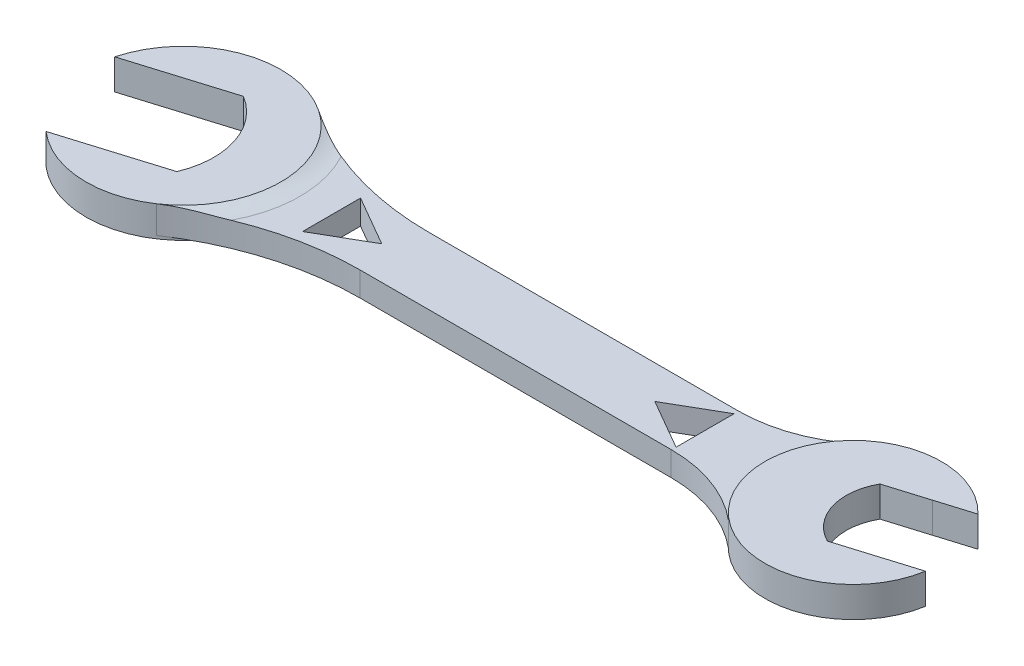
ISO-10303-21;
HEADER;
FILE_DESCRIPTION(('STEP AP214'),'2;1');
FILE_NAME('part.step','',(''),(''),'','','');
FILE_SCHEMA(('AUTOMOTIVE_DESIGN { 1 0 10303 214 1 1 1 1 }'));
ENDSEC;
DATA;
#1=APPLICATION_CONTEXT('core data for automotive mechanical design processes');
#2=APPLICATION_PROTOCOL_DEFINITION('international standard','automotive_design',2000,#1);
#3=PRODUCT_CONTEXT('',#1,'mechanical');
#4=PRODUCT('Part','Part','',(#3));
#5=PRODUCT_RELATED_PRODUCT_CATEGORY('part','',(#4));
#6=PRODUCT_DEFINITION_FORMATION('','',#4);
#7=PRODUCT_DEFINITION_CONTEXT('part definition',#1,'design');
#8=PRODUCT_DEFINITION('design','',#6,#7);
#9=PRODUCT_DEFINITION_SHAPE('','',#8);
#10=(LENGTH_UNIT() NAMED_UNIT(*) SI_UNIT(.MILLI.,.METRE.));
#11=(NAMED_UNIT(*) PLANE_ANGLE_UNIT() SI_UNIT($,.RADIAN.));
#12=(NAMED_UNIT(*) SI_UNIT($,.STERADIAN.) SOLID_ANGLE_UNIT());
#13=UNCERTAINTY_MEASURE_WITH_UNIT(LENGTH_MEASURE(1.E-05),#10,'distance_accuracy_value','');
#14=(GEOMETRIC_REPRESENTATION_CONTEXT(3) GLOBAL_UNCERTAINTY_ASSIGNED_CONTEXT((#13)) GLOBAL_UNIT_ASSIGNED_CONTEXT((#10,
#11,#12)) REPRESENTATION_CONTEXT('',''));
#15=CARTESIAN_POINT('',(0.,0.,0.));
#16=DIRECTION('',(0.,0.,1.));
#17=DIRECTION('',(1.,0.,0.));
#18=AXIS2_PLACEMENT_3D('',#15,#16,#17);
#19=CARTESIAN_POINT('',(30.602024101942,2.,28.5700682179415));
#20=DIRECTION('',(0.,-1.,0.));
#21=DIRECTION('',(0.,0.,-1.));
#22=AXIS2_PLACEMENT_3D('',#19,#20,#21);
#23=CYLINDRICAL_SURFACE('',#22,23.0700682179416);
#24=CARTESIAN_POINT('',(30.602024101942,-2.,28.5700682179415));
#25=DIRECTION('',(0.,1.,0.));
#26=DIRECTION('',(0.,0.,1.));
#27=AXIS2_PLACEMENT_3D('',#24,#25,#26);
#28=CIRCLE('',#27,23.0700682179416);
#29=CARTESIAN_POINT('',(45.5837101899976,-2.,11.0264902037668));
#30=VERTEX_POINT('',#29);
#31=CARTESIAN_POINT('',(30.602024101942,-2.,5.49999999999999));
#32=VERTEX_POINT('',#31);
#33=EDGE_CURVE('E342',#30,#32,#28,.T.);
#34=ORIENTED_EDGE('',*,*,#33,.F.);
#35=DIRECTION('',(0.,-1.,0.));
#36=VECTOR('',#35,1.);
#37=CARTESIAN_POINT('',(45.5837101899976,2.,11.0264902037668));
#38=LINE('',#37,#36);
#39=CARTESIAN_POINT('',(45.5837101899976,2.,11.0264902037668));
#40=VERTEX_POINT('',#39);
#41=EDGE_CURVE('E390',#40,#30,#38,.T.);
#42=ORIENTED_EDGE('',*,*,#41,.F.);
#43=CARTESIAN_POINT('',(30.602024101942,2.,28.5700682179415));
#44=DIRECTION('',(0.,1.,0.));
#45=DIRECTION('',(0.,0.,1.));
#46=AXIS2_PLACEMENT_3D('',#43,#44,#45);
#47=CIRCLE('',#46,23.0700682179416);
#48=CARTESIAN_POINT('',(30.602024101942,2.,5.49999999999999));
#49=VERTEX_POINT('',#48);
#50=EDGE_CURVE('E343',#40,#49,#47,.T.);
#51=ORIENTED_EDGE('',*,*,#50,.T.);
#52=DIRECTION('',(0.,-1.,0.));
#53=VECTOR('',#52,1.);
#54=CARTESIAN_POINT('',(30.602024101942,2.,5.49999999999999));
#55=LINE('',#54,#53);
#56=EDGE_CURVE('E359',#49,#32,#55,.T.);
#57=ORIENTED_EDGE('',*,*,#56,.T.);
#58=EDGE_LOOP('',(#34,#42,#51,#57));
#59=FACE_BOUND('',#58,.T.);
#60=ADVANCED_FACE('F37',(#59),#23,.F.);
#61=CARTESIAN_POINT('',(30.5761125724405,2.,-28.6403487263792));
#62=DIRECTION('',(0.,-1.,0.));
#63=DIRECTION('',(0.,0.,-1.));
#64=AXIS2_PLACEMENT_3D('',#61,#62,#63);
#65=CYLINDRICAL_SURFACE('',#64,23.1403487263792);
#66=CARTESIAN_POINT('',(30.5761125724405,-2.,-28.6403487263792));
#67=DIRECTION('',(0.,1.,0.));
#68=DIRECTION('',(0.,0.,1.));
#69=AXIS2_PLACEMENT_3D('',#66,#67,#68);
#70=CIRCLE('',#69,23.1403487263792);
#71=CARTESIAN_POINT('',(30.5761125724405,-2.,-5.49999999999999));
#72=VERTEX_POINT('',#71);
#73=CARTESIAN_POINT('',(45.5913101317451,-2.,-11.0329757981569));
#74=VERTEX_POINT('',#73);
#75=EDGE_CURVE('E362',#72,#74,#70,.T.);
#76=ORIENTED_EDGE('',*,*,#75,.F.);
#77=DIRECTION('',(0.,-1.,0.));
#78=VECTOR('',#77,1.);
#79=CARTESIAN_POINT('',(30.5761125724405,2.,-5.49999999999999));
#80=LINE('',#79,#78);
#81=CARTESIAN_POINT('',(30.5761125724405,2.,-5.49999999999999));
#82=VERTEX_POINT('',#81);
#83=EDGE_CURVE('E385',#82,#72,#80,.T.);
#84=ORIENTED_EDGE('',*,*,#83,.F.);
#85=CARTESIAN_POINT('',(30.5761125724405,2.,-28.6403487263792));
#86=DIRECTION('',(0.,1.,0.));
#87=DIRECTION('',(0.,0.,1.));
#88=AXIS2_PLACEMENT_3D('',#85,#86,#87);
#89=CIRCLE('',#88,23.1403487263792);
#90=CARTESIAN_POINT('',(45.5913101317451,2.,-11.0329757981569));
#91=VERTEX_POINT('',#90);
#92=EDGE_CURVE('E346',#82,#91,#89,.T.);
#93=ORIENTED_EDGE('',*,*,#92,.T.);
#94=DIRECTION('',(0.,-1.,0.));
#95=VECTOR('',#94,1.);
#96=CARTESIAN_POINT('',(45.5913101317451,2.,-11.0329757981569));
#97=LINE('',#96,#95);
#98=EDGE_CURVE('E387',#91,#74,#97,.T.);
#99=ORIENTED_EDGE('',*,*,#98,.T.);
#100=EDGE_LOOP('',(#76,#84,#93,#99));
#101=FACE_BOUND('',#100,.T.);
#102=ADVANCED_FACE('F406',(#101),#65,.F.);
#103=CARTESIAN_POINT('',(0.,2.,-5.5));
#104=DIRECTION('',(0.,0.,-1.));
#105=DIRECTION('',(-1.,0.,0.));
#106=AXIS2_PLACEMENT_3D('',#103,#104,#105);
#107=PLANE('',#106);
#108=DIRECTION('',(1.,0.,0.));
#109=VECTOR('',#108,1.);
#110=CARTESIAN_POINT('',(0.,-2.,-5.5));
#111=LINE('',#110,#109);
#112=CARTESIAN_POINT('',(-20.1503982962339,-2.,-5.5));
#113=VERTEX_POINT('',#112);
#114=EDGE_CURVE('E364',#113,#72,#111,.T.);
#115=ORIENTED_EDGE('',*,*,#114,.F.);
#116=DIRECTION('',(0.,-1.,0.));
#117=VECTOR('',#116,1.);
#118=CARTESIAN_POINT('',(-20.1503982962339,2.,-5.5));
#119=LINE('',#118,#117);
#120=CARTESIAN_POINT('',(-20.1503982962339,2.,-5.5));
#121=VERTEX_POINT('',#120);
#122=EDGE_CURVE('E383',#121,#113,#119,.T.);
#123=ORIENTED_EDGE('',*,*,#122,.F.);
#124=DIRECTION('',(1.,0.,0.));
#125=VECTOR('',#124,1.);
#126=CARTESIAN_POINT('',(0.,2.,-5.5));
#127=LINE('',#126,#125);
#128=EDGE_CURVE('E350',#121,#82,#127,.T.);
#129=ORIENTED_EDGE('',*,*,#128,.T.);
#130=ORIENTED_EDGE('',*,*,#83,.T.);
#131=EDGE_LOOP('',(#115,#123,#129,#130));
#132=FACE_BOUND('',#131,.T.);
#133=ADVANCED_FACE('F401',(#132),#107,.T.);
#134=CARTESIAN_POINT('',(-20.1503982962339,2.,-52.5830828052923));
#135=DIRECTION('',(0.,-1.,0.));
#136=DIRECTION('',(0.,0.,-1.));
#137=AXIS2_PLACEMENT_3D('',#134,#135,#136);
#138=CYLINDRICAL_SURFACE('',#137,47.0830828052923);
#139=CARTESIAN_POINT('',(-20.1503982962339,-2.,-52.5830828052923));
#140=DIRECTION('',(0.,1.,0.));
#141=DIRECTION('',(0.,0.,1.));
#142=AXIS2_PLACEMENT_3D('',#139,#140,#141);
#143=CIRCLE('',#142,47.0830828052923);
#144=CARTESIAN_POINT('',(-46.1609642004769,-2.,-13.3368454341628));
#145=VERTEX_POINT('',#144);
#146=EDGE_CURVE('E367',#145,#113,#143,.T.);
#147=ORIENTED_EDGE('',*,*,#146,.F.);
#148=DIRECTION('',(0.,-1.,0.));
#149=VECTOR('',#148,1.);
#150=CARTESIAN_POINT('',(-46.1609642004769,2.,-13.3368454341628));
#151=LINE('',#150,#149);
#152=CARTESIAN_POINT('',(-46.1609642004769,2.5,-13.3368454341628));
#153=VERTEX_POINT('',#152);
#154=EDGE_CURVE('E380',#153,#145,#151,.T.);
#155=ORIENTED_EDGE('',*,*,#154,.F.);
#156=CARTESIAN_POINT('',(-46.1609642004769,2.5,-13.3368454341628));
#157=CARTESIAN_POINT('',(-46.0030447717302,2.50001794667018,-13.2321833435018));
#158=CARTESIAN_POINT('',(-45.8444949441863,2.49851859391944,-13.128476257758));
#159=CARTESIAN_POINT('',(-45.5262010006009,2.49261645494171,-12.9230122951203));
#160=CARTESIAN_POINT('',(-45.3664569440749,2.48821381246138,-12.8212553219298));
#161=CARTESIAN_POINT('',(-45.045923376569,2.47663977289249,-12.6197829945343));
#162=CARTESIAN_POINT('',(-44.8851345641536,2.46947006950534,-12.520066430647));
#163=CARTESIAN_POINT('',(-44.5624630985112,2.45261795980704,-12.3226362916472));
#164=CARTESIAN_POINT('',(-44.4005804334794,2.44293552633648,-12.2249227381968));
#165=CARTESIAN_POINT('',(-43.9141310890422,2.41064465302424,-11.9352795175899));
#166=CARTESIAN_POINT('',(-43.5879850169606,2.38476161542484,-11.7463583338902));
#167=CARTESIAN_POINT('',(-42.931562067709,2.32765247553181,-11.3765635038842));
#168=CARTESIAN_POINT('',(-42.6012843059649,2.29642521027052,-11.1956916200192));
#169=CARTESIAN_POINT('',(-41.9366631925115,2.23279760476241,-10.8420118038289));
#170=CARTESIAN_POINT('',(-41.602320927446,2.20039757366456,-10.6692017734437));
#171=CARTESIAN_POINT('',(-40.9294189797346,2.13891924181095,-10.3315661219697));
#172=CARTESIAN_POINT('',(-40.5908603175638,2.10984015398728,-10.1667386143683));
#173=CARTESIAN_POINT('',(-39.9084798231682,2.05955481028613,-9.84460421447235));
#174=CARTESIAN_POINT('',(-39.5646467184875,2.03836893926361,-9.68731769670469));
#175=CARTESIAN_POINT('',(-38.8725931045107,2.00857666207752,-9.38077334912296));
#176=CARTESIAN_POINT('',(-38.5243694339608,1.999979911559,-9.2315217663882));
#177=CARTESIAN_POINT('',(-38.1742265343565,2.,-9.08643578402565));
#178=B_SPLINE_CURVE_WITH_KNOTS('',3,(#156,#157,#158,#159,#160,#161,#162,#163,#164,#165,#166,
#167,#168,#169,#170,#171,#172,#173,#174,#175,#176,#177),.UNSPECIFIED.,.F.,.F.,(4,2,2,2,2,2,2,2,
2,2,4),(0.,0.568348224302967,1.1366683108581,1.70464108239482,2.27261999324853,3.40582095643219,
4.53926883195,5.67242006836511,6.80530218666621,7.94109010850513,9.07774870527124),.UNSPECIFIED.);
#179=CARTESIAN_POINT('',(-38.1742265343565,2.,-9.08643578402565));
#180=VERTEX_POINT('',#179);
#181=EDGE_CURVE('E50',#153,#180,#178,.T.);
#182=ORIENTED_EDGE('',*,*,#181,.T.);
#183=CARTESIAN_POINT('',(-20.1503982962339,2.,-52.5830828052923));
#184=DIRECTION('',(0.,1.,0.));
#185=DIRECTION('',(0.,0.,1.));
#186=AXIS2_PLACEMENT_3D('',#183,#184,#185);
#187=CIRCLE('',#186,47.0830828052923);
#188=EDGE_CURVE('E353',#180,#121,#187,.T.);
#189=ORIENTED_EDGE('',*,*,#188,.T.);
#190=ORIENTED_EDGE('',*,*,#122,.T.);
#191=EDGE_LOOP('',(#147,#155,#182,#189,#190));
#192=FACE_BOUND('',#191,.T.);
#193=ADVANCED_FACE('F396',(#192),#138,.F.);
#194=CARTESIAN_POINT('',(-20.4607332261581,2.,51.5576642511723));
#195=DIRECTION('',(0.,-1.,0.));
#196=DIRECTION('',(0.,0.,-1.));
#197=AXIS2_PLACEMENT_3D('',#194,#195,#196);
#198=CYLINDRICAL_SURFACE('',#197,46.0576642511723);
#199=CARTESIAN_POINT('',(-20.4607332261581,-2.,51.5576642511723));
#200=DIRECTION('',(0.,1.,0.));
#201=DIRECTION('',(0.,0.,1.));
#202=AXIS2_PLACEMENT_3D('',#199,#200,#201);
#203=CIRCLE('',#202,46.0576642511723);
#204=CARTESIAN_POINT('',(-20.4607332261581,-2.,5.5));
#205=VERTEX_POINT('',#204);
#206=CARTESIAN_POINT('',(-46.0949231646109,-2.,13.2928404246728));
#207=VERTEX_POINT('',#206);
#208=EDGE_CURVE('E370',#205,#207,#203,.T.);
#209=ORIENTED_EDGE('',*,*,#208,.F.);
#210=DIRECTION('',(0.,-1.,0.));
#211=VECTOR('',#210,1.);
#212=CARTESIAN_POINT('',(-20.4607332261581,2.,5.5));
#213=LINE('',#212,#211);
#214=CARTESIAN_POINT('',(-20.4607332261581,2.,5.5));
#215=VERTEX_POINT('',#214);
#216=EDGE_CURVE('E376',#215,#205,#213,.T.);
#217=ORIENTED_EDGE('',*,*,#216,.F.);
#218=CARTESIAN_POINT('',(-20.4607332261581,2.,51.5576642511723));
#219=DIRECTION('',(0.,1.,0.));
#220=DIRECTION('',(0.,0.,1.));
#221=AXIS2_PLACEMENT_3D('',#218,#219,#220);
#222=CIRCLE('',#221,46.0576642511723);
#223=CARTESIAN_POINT('',(-38.1437675335776,2.,9.02980592329103));
#224=VERTEX_POINT('',#223);
#225=EDGE_CURVE('E355',#215,#224,#222,.T.);
#226=ORIENTED_EDGE('',*,*,#225,.T.);
#227=CARTESIAN_POINT('',(-38.1437675335776,2.,9.02980592329103));
#228=CARTESIAN_POINT('',(-38.492791995453,1.99997967438927,9.17492605106929));
#229=CARTESIAN_POINT('',(-38.8398621969387,2.00857560667225,9.32428032674096));
#230=CARTESIAN_POINT('',(-39.5295311902648,2.03836615468733,9.63116156915237));
#231=CARTESIAN_POINT('',(-39.8721332206021,2.05955106020622,9.78868215161592));
#232=CARTESIAN_POINT('',(-40.5519397750249,2.10983322775036,10.1113964140727));
#233=CARTESIAN_POINT('',(-40.8891561956109,2.13890937542938,10.2765686564694));
#234=CARTESIAN_POINT('',(-41.5592849694865,2.20038282593714,10.6150156091752));
#235=CARTESIAN_POINT('',(-41.8921962752647,2.23278092054791,10.7882922457794));
#236=CARTESIAN_POINT('',(-42.5538601600315,2.29640640277867,11.143024210344));
#237=CARTESIAN_POINT('',(-42.8826116246991,2.32763348093365,11.3244816727398));
#238=CARTESIAN_POINT('',(-43.5358803647675,2.38474392034687,11.6955634953655));
#239=CARTESIAN_POINT('',(-43.8603985522138,2.41062845106616,11.8851860572825));
#240=CARTESIAN_POINT('',(-44.3443372273918,2.44292328410054,12.1759751759117));
#241=CARTESIAN_POINT('',(-44.5053777451867,2.45260761872506,12.2740915000182));
#242=CARTESIAN_POINT('',(-44.8263366660858,2.46946317560282,12.4723551827721));
#243=CARTESIAN_POINT('',(-44.9862550813766,2.47663442519086,12.5725025193156));
#244=CARTESIAN_POINT('',(-45.3050187722593,2.48821104511997,12.7748643133208));
#245=CARTESIAN_POINT('',(-45.4638633270732,2.4926147110513,12.8770800046612));
#246=CARTESIAN_POINT('',(-45.78032828367,2.49851824097266,13.0834879334419));
#247=CARTESIAN_POINT('',(-45.9379486240476,2.50001796022866,13.1876802691376));
#248=CARTESIAN_POINT('',(-46.0949231646109,2.49999999999998,13.2928404246728));
#249=B_SPLINE_CURVE_WITH_KNOTS('',3,(#227,#228,#229,#230,#231,#232,#233,#234,#235,#236,#237,
#238,#239,#240,#241,#242,#243,#244,#245,#246,#247,#248),.UNSPECIFIED.,.F.,.F.,(4,2,2,2,2,2,2,2,
2,2,4),(0.,1.13359699027427,2.26632073961054,3.39604307725001,4.52603531154295,5.65632409458125,
6.78636519917245,7.3528122570287,7.91925315345483,8.48604255018711,9.05286019523477),.UNSPECIFIED.);
#250=CARTESIAN_POINT('',(-46.0949231646109,2.5,13.2928404246728));
#251=VERTEX_POINT('',#250);
#252=EDGE_CURVE('E12',#224,#251,#249,.T.);
#253=ORIENTED_EDGE('',*,*,#252,.T.);
#254=DIRECTION('',(0.,-1.,0.));
#255=VECTOR('',#254,1.);
#256=CARTESIAN_POINT('',(-46.0949231646109,2.,13.2928404246728));
#257=LINE('',#256,#255);
#258=EDGE_CURVE('E378',#251,#207,#257,.T.);
#259=ORIENTED_EDGE('',*,*,#258,.T.);
#260=EDGE_LOOP('',(#209,#217,#226,#253,#259));
#261=FACE_BOUND('',#260,.T.);
#262=ADVANCED_FACE('F400',(#261),#198,.F.);
#263=CARTESIAN_POINT('',(0.,2.,5.5));
#264=DIRECTION('',(0.,0.,-1.));
#265=DIRECTION('',(-1.,0.,0.));
#266=AXIS2_PLACEMENT_3D('',#263,#264,#265);
#267=PLANE('',#266);
#268=DIRECTION('',(1.,0.,0.));
#269=VECTOR('',#268,1.);
#270=CARTESIAN_POINT('',(0.,-2.,5.5));
#271=LINE('',#270,#269);
#272=EDGE_CURVE('E347',#205,#32,#271,.T.);
#273=ORIENTED_EDGE('',*,*,#272,.T.);
#274=ORIENTED_EDGE('',*,*,#56,.F.);
#275=DIRECTION('',(1.,0.,0.));
#276=VECTOR('',#275,1.);
#277=CARTESIAN_POINT('',(0.,2.,5.5));
#278=LINE('',#277,#276);
#279=EDGE_CURVE('E357',#215,#49,#278,.T.);
#280=ORIENTED_EDGE('',*,*,#279,.F.);
#281=ORIENTED_EDGE('',*,*,#216,.T.);
#282=EDGE_LOOP('',(#273,#274,#280,#281));
#283=FACE_BOUND('',#282,.T.);
#284=ADVANCED_FACE('F448',(#283),#267,.F.);
#285=CARTESIAN_POINT('',(0.,2.,0.));
#286=DIRECTION('',(0.,1.,0.));
#287=DIRECTION('',(0.,0.,1.));
#288=AXIS2_PLACEMENT_3D('',#285,#286,#287);
#289=PLANE('',#288);
#290=DIRECTION('',(-0.866025403784439,0.,0.5));
#291=VECTOR('',#290,1.);
#292=CARTESIAN_POINT('',(22.4246008674637,2.,0.));
#293=LINE('',#292,#291);
#294=CARTESIAN_POINT('',(30.6746008674636,2.,-4.76313972081441));
#295=VERTEX_POINT('',#294);
#296=CARTESIAN_POINT('',(22.4246008674637,2.,0.));
#297=VERTEX_POINT('',#296);
#298=EDGE_CURVE('E210',#295,#297,#293,.T.);
#299=ORIENTED_EDGE('',*,*,#298,.F.);
#300=DIRECTION('',(0.,0.,-1.));
#301=VECTOR('',#300,1.);
#302=CARTESIAN_POINT('',(30.6746008674636,2.,-4.76313972081441));
#303=LINE('',#302,#301);
#304=CARTESIAN_POINT('',(30.6746008674636,2.,4.7631397208144));
#305=VERTEX_POINT('',#304);
#306=EDGE_CURVE('E225',#305,#295,#303,.T.);
#307=ORIENTED_EDGE('',*,*,#306,.F.);
#308=DIRECTION('',(0.866025403784439,0.,0.5));
#309=VECTOR('',#308,1.);
#310=CARTESIAN_POINT('',(30.6746008674636,2.,4.7631397208144));
#311=LINE('',#310,#309);
#312=EDGE_CURVE('E228',#297,#305,#311,.T.);
#313=ORIENTED_EDGE('',*,*,#312,.F.);
#314=EDGE_LOOP('',(#299,#307,#313));
#315=FACE_BOUND('',#314,.T.);
#316=DIRECTION('',(0.866025403784438,0.,-0.5));
#317=VECTOR('',#316,1.);
#318=CARTESIAN_POINT('',(-30.6746008674636,2.,4.76313972081441));
#319=LINE('',#318,#317);
#320=CARTESIAN_POINT('',(-30.6746008674636,2.,4.76313972081441));
#321=VERTEX_POINT('',#320);
#322=CARTESIAN_POINT('',(-22.4246008674636,2.,0.));
#323=VERTEX_POINT('',#322);
#324=EDGE_CURVE('E236',#321,#323,#319,.T.);
#325=ORIENTED_EDGE('',*,*,#324,.F.);
#326=DIRECTION('',(0.,0.,1.));
#327=VECTOR('',#326,1.);
#328=CARTESIAN_POINT('',(-30.6746008674636,2.,-4.7631397208144));
#329=LINE('',#328,#327);
#330=CARTESIAN_POINT('',(-30.6746008674636,2.,-4.7631397208144));
#331=VERTEX_POINT('',#330);
#332=EDGE_CURVE('E242',#331,#321,#329,.T.);
#333=ORIENTED_EDGE('',*,*,#332,.F.);
#334=DIRECTION('',(-0.866025403784439,0.,-0.5));
#335=VECTOR('',#334,1.);
#336=CARTESIAN_POINT('',(-22.4246008674636,2.,0.));
#337=LINE('',#336,#335);
#338=EDGE_CURVE('E250',#323,#331,#337,.T.);
#339=ORIENTED_EDGE('',*,*,#338,.F.);
#340=EDGE_LOOP('',(#325,#333,#339));
#341=FACE_BOUND('',#340,.T.);
#342=ORIENTED_EDGE('',*,*,#188,.F.);
#343=CARTESIAN_POINT('',(-55.,2.,0.));
#344=DIRECTION('',(0.,1.,0.));
#345=DIRECTION('',(0.,0.,1.));
#346=AXIS2_PLACEMENT_3D('',#343,#344,#345);
#347=CIRCLE('',#346,19.1224989991992);
#348=EDGE_CURVE('E57',#180,#224,#347,.F.);
#349=ORIENTED_EDGE('',*,*,#348,.T.);
#350=ORIENTED_EDGE('',*,*,#225,.F.);
#351=ORIENTED_EDGE('',*,*,#279,.T.);
#352=ORIENTED_EDGE('',*,*,#50,.F.);
#353=CARTESIAN_POINT('',(55.,2.,0.));
#354=DIRECTION('',(0.,1.,0.));
#355=DIRECTION('',(0.,0.,1.));
#356=AXIS2_PLACEMENT_3D('',#353,#354,#355);
#357=CIRCLE('',#356,14.4999999999903);
#358=EDGE_CURVE('E294',#91,#40,#357,.T.);
#359=ORIENTED_EDGE('',*,*,#358,.F.);
#360=ORIENTED_EDGE('',*,*,#92,.F.);
#361=ORIENTED_EDGE('',*,*,#128,.F.);
#362=EDGE_LOOP('',(#342,#349,#350,#351,#352,#359,#360,#361));
#363=FACE_BOUND('',#362,.T.);
#364=ADVANCED_FACE('F426',(#315,#341,#363),#289,.T.);
#365=CARTESIAN_POINT('',(0.,-2.,0.));
#366=DIRECTION('',(0.,1.,0.));
#367=DIRECTION('',(0.,0.,1.));
#368=AXIS2_PLACEMENT_3D('',#365,#366,#367);
#369=PLANE('',#368);
#370=DIRECTION('',(0.,0.,-1.));
#371=VECTOR('',#370,1.);
#372=CARTESIAN_POINT('',(30.6746008674636,-2.,-4.76313972081441));
#373=LINE('',#372,#371);
#374=CARTESIAN_POINT('',(30.6746008674636,-2.,4.7631397208144));
#375=VERTEX_POINT('',#374);
#376=CARTESIAN_POINT('',(30.6746008674636,-2.,-4.76313972081441));
#377=VERTEX_POINT('',#376);
#378=EDGE_CURVE('E215',#375,#377,#373,.T.);
#379=ORIENTED_EDGE('',*,*,#378,.T.);
#380=DIRECTION('',(-0.866025403784439,0.,0.5));
#381=VECTOR('',#380,1.);
#382=CARTESIAN_POINT('',(22.4246008674637,-2.,0.));
#383=LINE('',#382,#381);
#384=CARTESIAN_POINT('',(22.4246008674637,-2.,0.));
#385=VERTEX_POINT('',#384);
#386=EDGE_CURVE('E207',#377,#385,#383,.T.);
#387=ORIENTED_EDGE('',*,*,#386,.T.);
#388=DIRECTION('',(0.866025403784439,0.,0.5));
#389=VECTOR('',#388,1.);
#390=CARTESIAN_POINT('',(30.6746008674636,-2.,4.7631397208144));
#391=LINE('',#390,#389);
#392=EDGE_CURVE('E219',#385,#375,#391,.T.);
#393=ORIENTED_EDGE('',*,*,#392,.T.);
#394=EDGE_LOOP('',(#379,#387,#393));
#395=FACE_BOUND('',#394,.T.);
#396=DIRECTION('',(0.,0.,1.));
#397=VECTOR('',#396,1.);
#398=CARTESIAN_POINT('',(-30.6746008674636,-2.,-4.7631397208144));
#399=LINE('',#398,#397);
#400=CARTESIAN_POINT('',(-30.6746008674636,-2.,-4.7631397208144));
#401=VERTEX_POINT('',#400);
#402=CARTESIAN_POINT('',(-30.6746008674636,-2.,4.76313972081441));
#403=VERTEX_POINT('',#402);
#404=EDGE_CURVE('E245',#401,#403,#399,.T.);
#405=ORIENTED_EDGE('',*,*,#404,.T.);
#406=DIRECTION('',(0.866025403784438,0.,-0.5));
#407=VECTOR('',#406,1.);
#408=CARTESIAN_POINT('',(-30.6746008674636,-2.,4.76313972081441));
#409=LINE('',#408,#407);
#410=CARTESIAN_POINT('',(-22.4246008674636,-2.,0.));
#411=VERTEX_POINT('',#410);
#412=EDGE_CURVE('E238',#403,#411,#409,.T.);
#413=ORIENTED_EDGE('',*,*,#412,.T.);
#414=DIRECTION('',(-0.866025403784439,0.,-0.5));
#415=VECTOR('',#414,1.);
#416=CARTESIAN_POINT('',(-22.4246008674636,-2.,0.));
#417=LINE('',#416,#415);
#418=EDGE_CURVE('E241',#411,#401,#417,.T.);
#419=ORIENTED_EDGE('',*,*,#418,.T.);
#420=EDGE_LOOP('',(#405,#413,#419));
#421=FACE_BOUND('',#420,.T.);
#422=ORIENTED_EDGE('',*,*,#75,.T.);
#423=CARTESIAN_POINT('',(55.,-2.,0.));
#424=DIRECTION('',(0.,1.,0.));
#425=DIRECTION('',(0.,0.,1.));
#426=AXIS2_PLACEMENT_3D('',#423,#424,#425);
#427=CIRCLE('',#426,14.4999999999903);
#428=EDGE_CURVE('E291',#74,#30,#427,.T.);
#429=ORIENTED_EDGE('',*,*,#428,.T.);
#430=ORIENTED_EDGE('',*,*,#33,.T.);
#431=ORIENTED_EDGE('',*,*,#272,.F.);
#432=ORIENTED_EDGE('',*,*,#208,.T.);
#433=CARTESIAN_POINT('',(-55.,-2.,0.));
#434=DIRECTION('',(0.,1.,0.));
#435=DIRECTION('',(0.,0.,1.));
#436=AXIS2_PLACEMENT_3D('',#433,#434,#435);
#437=CIRCLE('',#436,16.);
#438=EDGE_CURVE('E322',#207,#145,#437,.T.);
#439=ORIENTED_EDGE('',*,*,#438,.T.);
#440=ORIENTED_EDGE('',*,*,#146,.T.);
#441=ORIENTED_EDGE('',*,*,#114,.T.);
#442=EDGE_LOOP('',(#422,#429,#430,#431,#432,#439,#440,#441));
#443=FACE_BOUND('',#442,.T.);
#444=ADVANCED_FACE('F223',(#395,#421,#443),#369,.F.);
#445=CARTESIAN_POINT('',(-55.,2.,0.));
#446=DIRECTION('',(0.,-1.,0.));
#447=DIRECTION('',(0.,0.,-1.));
#448=AXIS2_PLACEMENT_3D('',#445,#446,#447);
#449=CYLINDRICAL_SURFACE('',#448,16.);
#450=CARTESIAN_POINT('',(-55.,2.5,0.));
#451=DIRECTION('',(0.,1.,0.));
#452=DIRECTION('',(0.,0.,-1.));
#453=AXIS2_PLACEMENT_3D('',#450,#451,#452);
#454=CIRCLE('',#453,16.);
#455=CARTESIAN_POINT('',(-70.4482928682465,2.5,-4.16536282415877));
#456=VERTEX_POINT('',#455);
#457=EDGE_CURVE('E296',#153,#456,#454,.T.);
#458=ORIENTED_EDGE('',*,*,#457,.F.);
#459=ORIENTED_EDGE('',*,*,#154,.T.);
#460=ORIENTED_EDGE('',*,*,#438,.F.);
#461=ORIENTED_EDGE('',*,*,#258,.F.);
#462=CARTESIAN_POINT('',(-65.4779738879599,2.5,12.0918180272128));
#463=VERTEX_POINT('',#462);
#464=EDGE_CURVE('E297',#463,#251,#454,.T.);
#465=ORIENTED_EDGE('',*,*,#464,.F.);
#466=DIRECTION('',(0.,-1.,0.));
#467=VECTOR('',#466,1.);
#468=CARTESIAN_POINT('',(-65.4779738879599,2.,12.0918180272128));
#469=LINE('',#468,#467);
#470=CARTESIAN_POINT('',(-65.4779738879599,-2.5,12.0918180272128));
#471=VERTEX_POINT('',#470);
#472=EDGE_CURVE('E338',#463,#471,#469,.T.);
#473=ORIENTED_EDGE('',*,*,#472,.T.);
#474=CARTESIAN_POINT('',(-55.,-2.5,0.));
#475=DIRECTION('',(0.,1.,0.));
#476=DIRECTION('',(0.,0.,1.));
#477=AXIS2_PLACEMENT_3D('',#474,#475,#476);
#478=CIRCLE('',#477,16.);
#479=CARTESIAN_POINT('',(-70.4482928682465,-2.5,-4.16536282415877));
#480=VERTEX_POINT('',#479);
#481=EDGE_CURVE('E316',#480,#471,#478,.F.);
#482=ORIENTED_EDGE('',*,*,#481,.F.);
#483=DIRECTION('',(0.,-1.,0.));
#484=VECTOR('',#483,1.);
#485=CARTESIAN_POINT('',(-70.4482928682465,2.,-4.16536282415877));
#486=LINE('',#485,#484);
#487=EDGE_CURVE('E336',#456,#480,#486,.T.);
#488=ORIENTED_EDGE('',*,*,#487,.F.);
#489=EDGE_LOOP('',(#458,#459,#460,#461,#465,#473,#482,#488));
#490=FACE_BOUND('',#489,.T.);
#491=ADVANCED_FACE('F442',(#490),#449,.T.);
#492=CARTESIAN_POINT('',(-61.,2.,2.));
#493=DIRECTION('',(0.,-1.,0.));
#494=DIRECTION('',(0.,0.,-1.));
#495=AXIS2_PLACEMENT_3D('',#492,#493,#494);
#496=CYLINDRICAL_SURFACE('',#495,13.);
#497=DIRECTION('',(0.,-1.,0.));
#498=VECTOR('',#497,1.);
#499=CARTESIAN_POINT('',(-54.2581453889774,2.,-9.11518764591194));
#500=LINE('',#499,#498);
#501=CARTESIAN_POINT('',(-54.2581453889774,2.5,-9.11518764591194));
#502=VERTEX_POINT('',#501);
#503=CARTESIAN_POINT('',(-54.2581453889774,-2.5,-9.11518764591194));
#504=VERTEX_POINT('',#503);
#505=EDGE_CURVE('E334',#502,#504,#500,.T.);
#506=ORIENTED_EDGE('',*,*,#505,.T.);
#507=CARTESIAN_POINT('',(-61.,-2.5,2.));
#508=DIRECTION('',(0.,1.,0.));
#509=DIRECTION('',(0.,0.,1.));
#510=AXIS2_PLACEMENT_3D('',#507,#508,#509);
#511=CIRCLE('',#510,13.);
#512=CARTESIAN_POINT('',(-49.025998156324,-2.5,7.0619442754384));
#513=VERTEX_POINT('',#512);
#514=EDGE_CURVE('E310',#513,#504,#511,.T.);
#515=ORIENTED_EDGE('',*,*,#514,.F.);
#516=DIRECTION('',(0.,-1.,0.));
#517=VECTOR('',#516,1.);
#518=CARTESIAN_POINT('',(-49.025998156324,2.,7.0619442754384));
#519=LINE('',#518,#517);
#520=CARTESIAN_POINT('',(-49.025998156324,2.5,7.0619442754384));
#521=VERTEX_POINT('',#520);
#522=EDGE_CURVE('E340',#521,#513,#519,.T.);
#523=ORIENTED_EDGE('',*,*,#522,.F.);
#524=CARTESIAN_POINT('',(-61.,2.5,2.));
#525=DIRECTION('',(0.,-1.,0.));
#526=DIRECTION('',(0.,0.,1.));
#527=AXIS2_PLACEMENT_3D('',#524,#525,#526);
#528=CIRCLE('',#527,13.);
#529=EDGE_CURVE('E304',#502,#521,#528,.T.);
#530=ORIENTED_EDGE('',*,*,#529,.F.);
#531=EDGE_LOOP('',(#506,#515,#523,#530));
#532=FACE_BOUND('',#531,.T.);
#533=ADVANCED_FACE('F459',(#532),#496,.F.);
#534=CARTESIAN_POINT('',(-2.21630726459312,2.,-7.2492144197598));
#535=DIRECTION('',(0.292371704722738,0.,0.956304755963035));
#536=DIRECTION('',(0.956304755963035,0.,-0.292371704722738));
#537=AXIS2_PLACEMENT_3D('',#534,#535,#536);
#538=PLANE('',#537);
#539=ORIENTED_EDGE('',*,*,#522,.T.);
#540=DIRECTION('',(0.956304755963035,0.,-0.292371704722738));
#541=VECTOR('',#540,1.);
#542=CARTESIAN_POINT('',(-49.025998156324,-2.5,7.0619442754384));
#543=LINE('',#542,#541);
#544=EDGE_CURVE('E313',#471,#513,#543,.T.);
#545=ORIENTED_EDGE('',*,*,#544,.F.);
#546=ORIENTED_EDGE('',*,*,#472,.F.);
#547=DIRECTION('',(-0.956304755963035,0.,0.292371704722738));
#548=VECTOR('',#547,1.);
#549=CARTESIAN_POINT('',(-49.025998156324,2.5,7.0619442754384));
#550=LINE('',#549,#548);
#551=EDGE_CURVE('E307',#521,#463,#550,.T.);
#552=ORIENTED_EDGE('',*,*,#551,.F.);
#553=EDGE_LOOP('',(#539,#545,#546,#552));
#554=FACE_BOUND('',#553,.T.);
#555=ADVANCED_FACE('F462',(#554),#538,.F.);
#556=CARTESIAN_POINT('',(-7.18662624487966,2.,-23.5063952711314));
#557=DIRECTION('',(0.292371704722738,0.,0.956304755963035));
#558=DIRECTION('',(0.956304755963035,0.,-0.292371704722738));
#559=AXIS2_PLACEMENT_3D('',#556,#557,#558);
#560=PLANE('',#559);
#561=ORIENTED_EDGE('',*,*,#487,.T.);
#562=DIRECTION('',(-0.956304755963035,0.,0.292371704722738));
#563=VECTOR('',#562,1.);
#564=CARTESIAN_POINT('',(-54.2581453889774,-2.5,-9.11518764591194));
#565=LINE('',#564,#563);
#566=EDGE_CURVE('E319',#504,#480,#565,.T.);
#567=ORIENTED_EDGE('',*,*,#566,.F.);
#568=ORIENTED_EDGE('',*,*,#505,.F.);
#569=DIRECTION('',(0.956304755963035,0.,-0.292371704722738));
#570=VECTOR('',#569,1.);
#571=CARTESIAN_POINT('',(-54.2581453889774,2.5,-9.11518764591194));
#572=LINE('',#571,#570);
#573=EDGE_CURVE('E300',#456,#502,#572,.T.);
#574=ORIENTED_EDGE('',*,*,#573,.F.);
#575=EDGE_LOOP('',(#561,#567,#568,#574));
#576=FACE_BOUND('',#575,.T.);
#577=ADVANCED_FACE('F466',(#576),#560,.T.);
#578=CARTESIAN_POINT('',(55.,2.,0.));
#579=DIRECTION('',(0.,-1.,0.));
#580=DIRECTION('',(0.,0.,-1.));
#581=AXIS2_PLACEMENT_3D('',#578,#579,#580);
#582=CYLINDRICAL_SURFACE('',#581,14.4999999999903);
#583=CARTESIAN_POINT('',(55.,2.5,0.));
#584=DIRECTION('',(0.,1.,0.));
#585=DIRECTION('',(0.,0.,1.));
#586=AXIS2_PLACEMENT_3D('',#583,#584,#585);
#587=CIRCLE('',#586,14.4999999999903);
#588=CARTESIAN_POINT('',(65.4859791711139,2.5,-10.014701234819));
#589=VERTEX_POINT('',#588);
#590=CARTESIAN_POINT('',(69.2976523946134,2.5,2.41394614739564));
#591=VERTEX_POINT('',#590);
#592=EDGE_CURVE('E257',#589,#591,#587,.T.);
#593=ORIENTED_EDGE('',*,*,#592,.F.);
#594=DIRECTION('',(0.,-1.,0.));
#595=VECTOR('',#594,1.);
#596=CARTESIAN_POINT('',(65.4859791711139,2.,-10.014701234819));
#597=LINE('',#596,#595);
#598=CARTESIAN_POINT('',(65.4859791711139,-2.5,-10.014701234819));
#599=VERTEX_POINT('',#598);
#600=EDGE_CURVE('E328',#589,#599,#597,.T.);
#601=ORIENTED_EDGE('',*,*,#600,.T.);
#602=CARTESIAN_POINT('',(55.,-2.5,0.));
#603=DIRECTION('',(0.,1.,0.));
#604=DIRECTION('',(0.,0.,1.));
#605=AXIS2_PLACEMENT_3D('',#602,#603,#604);
#606=CIRCLE('',#605,14.4999999999903);
#607=CARTESIAN_POINT('',(69.2976523946134,-2.5,2.41394614739564));
#608=VERTEX_POINT('',#607);
#609=EDGE_CURVE('E288',#608,#599,#606,.F.);
#610=ORIENTED_EDGE('',*,*,#609,.F.);
#611=DIRECTION('',(0.,-1.,0.));
#612=VECTOR('',#611,1.);
#613=CARTESIAN_POINT('',(69.2976523946134,2.,2.41394614739564));
#614=LINE('',#613,#612);
#615=EDGE_CURVE('E326',#591,#608,#614,.T.);
#616=ORIENTED_EDGE('',*,*,#615,.F.);
#617=EDGE_LOOP('',(#593,#601,#610,#616));
#618=FACE_BOUND('',#617,.T.);
#619=ORIENTED_EDGE('',*,*,#98,.F.);
#620=ORIENTED_EDGE('',*,*,#358,.T.);
#621=ORIENTED_EDGE('',*,*,#41,.T.);
#622=ORIENTED_EDGE('',*,*,#428,.F.);
#623=EDGE_LOOP('',(#619,#620,#621,#622));
#624=FACE_BOUND('',#623,.T.);
#625=ADVANCED_FACE('F424',(#618,#624),#582,.T.);
#626=CARTESIAN_POINT('',(60.9999999999997,2.,-1.84620334864272));
#627=DIRECTION('',(0.,-1.,0.));
#628=DIRECTION('',(0.,0.,-1.));
#629=AXIS2_PLACEMENT_3D('',#626,#627,#628);
#630=CYLINDRICAL_SURFACE('',#629,9.0000000000017);
#631=DIRECTION('',(0.,-1.,0.));
#632=VECTOR('',#631,1.);
#633=CARTESIAN_POINT('',(56.9474669823042,2.,6.18977674967219));
#634=LINE('',#633,#632);
#635=CARTESIAN_POINT('',(56.9474669823041,2.5,6.18977674967243));
#636=VERTEX_POINT('',#635);
#637=CARTESIAN_POINT('',(56.9474669823041,-2.5,6.18977674967223));
#638=VERTEX_POINT('',#637);
#639=EDGE_CURVE('E324',#636,#638,#634,.T.);
#640=ORIENTED_EDGE('',*,*,#639,.T.);
#641=CARTESIAN_POINT('',(60.9999999999997,-2.5,-1.84620334864272));
#642=DIRECTION('',(0.,1.,0.));
#643=DIRECTION('',(0.,0.,1.));
#644=AXIS2_PLACEMENT_3D('',#641,#642,#643);
#645=CIRCLE('',#644,9.0000000000017);
#646=CARTESIAN_POINT('',(53.1513871549767,-2.5,-6.25066431554549));
#647=VERTEX_POINT('',#646);
#648=EDGE_CURVE('E279',#647,#638,#645,.T.);
#649=ORIENTED_EDGE('',*,*,#648,.F.);
#650=DIRECTION('',(0.,-1.,0.));
#651=VECTOR('',#650,1.);
#652=CARTESIAN_POINT('',(53.1513871549765,2.,-6.25066431554562));
#653=LINE('',#652,#651);
#654=CARTESIAN_POINT('',(53.1513871549765,2.5,-6.25066431554562));
#655=VERTEX_POINT('',#654);
#656=EDGE_CURVE('E332',#655,#647,#653,.T.);
#657=ORIENTED_EDGE('',*,*,#656,.F.);
#658=CARTESIAN_POINT('',(60.9999999999997,2.5,-1.84620334864272));
#659=DIRECTION('',(0.,-1.,0.));
#660=DIRECTION('',(0.,0.,1.));
#661=AXIS2_PLACEMENT_3D('',#658,#659,#660);
#662=CIRCLE('',#661,9.0000000000017);
#663=EDGE_CURVE('E267',#636,#655,#662,.T.);
#664=ORIENTED_EDGE('',*,*,#663,.F.);
#665=EDGE_LOOP('',(#640,#649,#657,#664));
#666=FACE_BOUND('',#665,.T.);
#667=ADVANCED_FACE('F473',(#666),#630,.F.);
#668=CARTESIAN_POINT('',(2.77203010348825,2.,9.09844775833813));
#669=DIRECTION('',(-0.291444243830032,0.,-0.956587817577843));
#670=DIRECTION('',(-0.956587817577843,0.,0.291444243830032));
#671=AXIS2_PLACEMENT_3D('',#668,#669,#670);
#672=PLANE('',#671);
#673=ORIENTED_EDGE('',*,*,#656,.T.);
#674=DIRECTION('',(-0.956587817577843,0.,0.291444243830032));
#675=VECTOR('',#674,1.);
#676=CARTESIAN_POINT('',(53.1513871549765,-2.5,-6.25066431554562));
#677=LINE('',#676,#675);
#678=CARTESIAN_POINT('',(59.7798547651221,-2.5,-8.27016393167317));
#679=VERTEX_POINT('',#678);
#680=EDGE_CURVE('E282',#679,#647,#677,.T.);
#681=ORIENTED_EDGE('',*,*,#680,.F.);
#682=DIRECTION('',(0.,-1.,0.));
#683=VECTOR('',#682,1.);
#684=CARTESIAN_POINT('',(59.7798547651221,2.,-8.27016393167317));
#685=LINE('',#684,#683);
#686=CARTESIAN_POINT('',(59.7798547651221,2.5,-8.27016393167317));
#687=VERTEX_POINT('',#686);
#688=EDGE_CURVE('E330',#687,#679,#685,.T.);
#689=ORIENTED_EDGE('',*,*,#688,.F.);
#690=DIRECTION('',(0.956587817577843,0.,-0.291444243830032));
#691=VECTOR('',#690,1.);
#692=CARTESIAN_POINT('',(53.1513871549765,2.5,-6.25066431554562));
#693=LINE('',#692,#691);
#694=EDGE_CURVE('E270',#655,#687,#693,.T.);
#695=ORIENTED_EDGE('',*,*,#694,.F.);
#696=EDGE_LOOP('',(#673,#681,#689,#695));
#697=FACE_BOUND('',#696,.T.);
#698=ADVANCED_FACE('F476',(#697),#672,.F.);
#699=CARTESIAN_POINT('',(2.7977460509704,2.,9.15101499659638));
#700=DIRECTION('',(-0.292371704724893,0.,-0.956304755962376));
#701=DIRECTION('',(-0.956304755962376,0.,0.292371704724893));
#702=AXIS2_PLACEMENT_3D('',#699,#700,#701);
#703=PLANE('',#702);
#704=ORIENTED_EDGE('',*,*,#688,.T.);
#705=DIRECTION('',(-0.956304755962376,0.,0.292371704724893));
#706=VECTOR('',#705,1.);
#707=CARTESIAN_POINT('',(59.7798547651221,-2.5,-8.27016393167317));
#708=LINE('',#707,#706);
#709=EDGE_CURVE('E285',#599,#679,#708,.T.);
#710=ORIENTED_EDGE('',*,*,#709,.F.);
#711=ORIENTED_EDGE('',*,*,#600,.F.);
#712=DIRECTION('',(0.956304755962376,0.,-0.292371704724893));
#713=VECTOR('',#712,1.);
#714=CARTESIAN_POINT('',(59.7798547651221,2.5,-8.27016393167317));
#715=LINE('',#714,#713);
#716=EDGE_CURVE('E273',#687,#589,#715,.T.);
#717=ORIENTED_EDGE('',*,*,#716,.F.);
#718=EDGE_LOOP('',(#704,#710,#711,#717));
#719=FACE_BOUND('',#718,.T.);
#720=ADVANCED_FACE('F480',(#719),#703,.F.);
#721=CARTESIAN_POINT('',(6.59857821239408,2.,21.5829768241074));
#722=DIRECTION('',(-0.292371704724895,0.,-0.956304755962376));
#723=DIRECTION('',(-0.956304755962376,0.,0.292371704724895));
#724=AXIS2_PLACEMENT_3D('',#721,#722,#723);
#725=PLANE('',#724);
#726=ORIENTED_EDGE('',*,*,#615,.T.);
#727=DIRECTION('',(0.956304755962376,0.,-0.292371704724893));
#728=VECTOR('',#727,1.);
#729=CARTESIAN_POINT('',(56.9474669823042,-2.5,6.18977674967219));
#730=LINE('',#729,#728);
#731=EDGE_CURVE('E276',#638,#608,#730,.T.);
#732=ORIENTED_EDGE('',*,*,#731,.F.);
#733=ORIENTED_EDGE('',*,*,#639,.F.);
#734=DIRECTION('',(-0.956304755962376,0.,0.292371704724893));
#735=VECTOR('',#734,1.);
#736=CARTESIAN_POINT('',(56.9474669823042,2.5,6.18977674967219));
#737=LINE('',#736,#735);
#738=EDGE_CURVE('E264',#591,#636,#737,.T.);
#739=ORIENTED_EDGE('',*,*,#738,.F.);
#740=EDGE_LOOP('',(#726,#732,#733,#739));
#741=FACE_BOUND('',#740,.T.);
#742=ADVANCED_FACE('F484',(#741),#725,.T.);
#743=CARTESIAN_POINT('',(0.,-2.5,0.));
#744=DIRECTION('',(0.,1.,0.));
#745=DIRECTION('',(0.,0.,1.));
#746=AXIS2_PLACEMENT_3D('',#743,#744,#745);
#747=PLANE('',#746);
#748=ORIENTED_EDGE('',*,*,#481,.T.);
#749=ORIENTED_EDGE('',*,*,#544,.T.);
#750=ORIENTED_EDGE('',*,*,#514,.T.);
#751=ORIENTED_EDGE('',*,*,#566,.T.);
#752=EDGE_LOOP('',(#748,#749,#750,#751));
#753=FACE_BOUND('',#752,.T.);
#754=ADVANCED_FACE('F491',(#753),#747,.F.);
#755=CARTESIAN_POINT('',(-55.,2.5,0.));
#756=DIRECTION('',(0.,-1.,0.));
#757=DIRECTION('',(0.,0.,-1.));
#758=AXIS2_PLACEMENT_3D('',#755,#756,#757);
#759=PLANE('',#758);
#760=ORIENTED_EDGE('',*,*,#464,.T.);
#761=EDGE_CURVE('E301',#251,#153,#454,.T.);
#762=ORIENTED_EDGE('',*,*,#761,.T.);
#763=ORIENTED_EDGE('',*,*,#457,.T.);
#764=ORIENTED_EDGE('',*,*,#573,.T.);
#765=ORIENTED_EDGE('',*,*,#529,.T.);
#766=ORIENTED_EDGE('',*,*,#551,.T.);
#767=EDGE_LOOP('',(#760,#762,#763,#764,#765,#766));
#768=FACE_BOUND('',#767,.T.);
#769=ADVANCED_FACE('F439',(#768),#759,.F.);
#770=CARTESIAN_POINT('',(0.,-2.5,0.));
#771=DIRECTION('',(0.,1.,0.));
#772=DIRECTION('',(0.,0.,1.));
#773=AXIS2_PLACEMENT_3D('',#770,#771,#772);
#774=PLANE('',#773);
#775=ORIENTED_EDGE('',*,*,#709,.T.);
#776=ORIENTED_EDGE('',*,*,#680,.T.);
#777=ORIENTED_EDGE('',*,*,#648,.T.);
#778=ORIENTED_EDGE('',*,*,#731,.T.);
#779=ORIENTED_EDGE('',*,*,#609,.T.);
#780=EDGE_LOOP('',(#775,#776,#777,#778,#779));
#781=FACE_BOUND('',#780,.T.);
#782=ADVANCED_FACE('F498',(#781),#774,.F.);
#783=CARTESIAN_POINT('',(55.,2.5,0.));
#784=DIRECTION('',(0.,1.,0.));
#785=DIRECTION('',(0.,0.,1.));
#786=AXIS2_PLACEMENT_3D('',#783,#784,#785);
#787=PLANE('',#786);
#788=ORIENTED_EDGE('',*,*,#592,.T.);
#789=ORIENTED_EDGE('',*,*,#738,.T.);
#790=ORIENTED_EDGE('',*,*,#663,.T.);
#791=ORIENTED_EDGE('',*,*,#694,.T.);
#792=ORIENTED_EDGE('',*,*,#716,.T.);
#793=EDGE_LOOP('',(#788,#789,#790,#791,#792));
#794=FACE_BOUND('',#793,.T.);
#795=ADVANCED_FACE('F501',(#794),#787,.T.);
#796=CARTESIAN_POINT('',(-30.6746008674636,-2.,4.76313972081441));
#797=DIRECTION('',(0.5,0.,0.866025403784438));
#798=DIRECTION('',(0.866025403784439,0.,-0.5));
#799=AXIS2_PLACEMENT_3D('',#796,#797,#798);
#800=PLANE('',#799);
#801=ORIENTED_EDGE('',*,*,#324,.T.);
#802=DIRECTION('',(0.,1.,0.));
#803=VECTOR('',#802,1.);
#804=CARTESIAN_POINT('',(-22.4246008674636,-2.,0.));
#805=LINE('',#804,#803);
#806=EDGE_CURVE('E248',#411,#323,#805,.T.);
#807=ORIENTED_EDGE('',*,*,#806,.F.);
#808=ORIENTED_EDGE('',*,*,#412,.F.);
#809=DIRECTION('',(0.,1.,0.));
#810=VECTOR('',#809,1.);
#811=CARTESIAN_POINT('',(-30.6746008674636,-2.,4.76313972081441));
#812=LINE('',#811,#810);
#813=EDGE_CURVE('E255',#403,#321,#812,.T.);
#814=ORIENTED_EDGE('',*,*,#813,.T.);
#815=EDGE_LOOP('',(#801,#807,#808,#814));
#816=FACE_BOUND('',#815,.T.);
#817=ADVANCED_FACE('F505',(#816),#800,.F.);
#818=CARTESIAN_POINT('',(-30.6746008674636,-2.,-4.7631397208144));
#819=DIRECTION('',(-1.,0.,0.));
#820=DIRECTION('',(0.,0.,1.));
#821=AXIS2_PLACEMENT_3D('',#818,#819,#820);
#822=PLANE('',#821);
#823=ORIENTED_EDGE('',*,*,#332,.T.);
#824=ORIENTED_EDGE('',*,*,#813,.F.);
#825=ORIENTED_EDGE('',*,*,#404,.F.);
#826=DIRECTION('',(0.,1.,0.));
#827=VECTOR('',#826,1.);
#828=CARTESIAN_POINT('',(-30.6746008674636,-2.,-4.7631397208144));
#829=LINE('',#828,#827);
#830=EDGE_CURVE('E258',#401,#331,#829,.T.);
#831=ORIENTED_EDGE('',*,*,#830,.T.);
#832=EDGE_LOOP('',(#823,#824,#825,#831));
#833=FACE_BOUND('',#832,.T.);
#834=ADVANCED_FACE('F509',(#833),#822,.F.);
#835=CARTESIAN_POINT('',(-22.4246008674636,-2.,0.));
#836=DIRECTION('',(0.5,0.,-0.866025403784439));
#837=DIRECTION('',(-0.866025403784439,0.,-0.5));
#838=AXIS2_PLACEMENT_3D('',#835,#836,#837);
#839=PLANE('',#838);
#840=ORIENTED_EDGE('',*,*,#338,.T.);
#841=ORIENTED_EDGE('',*,*,#830,.F.);
#842=ORIENTED_EDGE('',*,*,#418,.F.);
#843=ORIENTED_EDGE('',*,*,#806,.T.);
#844=EDGE_LOOP('',(#840,#841,#842,#843));
#845=FACE_BOUND('',#844,.T.);
#846=ADVANCED_FACE('F511',(#845),#839,.F.);
#847=CARTESIAN_POINT('',(22.4246008674637,-2.,0.));
#848=DIRECTION('',(-0.5,0.,-0.866025403784439));
#849=DIRECTION('',(-0.866025403784439,0.,0.5));
#850=AXIS2_PLACEMENT_3D('',#847,#848,#849);
#851=PLANE('',#850);
#852=ORIENTED_EDGE('',*,*,#298,.T.);
#853=DIRECTION('',(0.,1.,0.));
#854=VECTOR('',#853,1.);
#855=CARTESIAN_POINT('',(22.4246008674637,-2.,0.));
#856=LINE('',#855,#854);
#857=EDGE_CURVE('E203',#385,#297,#856,.T.);
#858=ORIENTED_EDGE('',*,*,#857,.F.);
#859=ORIENTED_EDGE('',*,*,#386,.F.);
#860=DIRECTION('',(0.,1.,0.));
#861=VECTOR('',#860,1.);
#862=CARTESIAN_POINT('',(30.6746008674636,-2.,-4.76313972081441));
#863=LINE('',#862,#861);
#864=EDGE_CURVE('E234',#377,#295,#863,.T.);
#865=ORIENTED_EDGE('',*,*,#864,.T.);
#866=EDGE_LOOP('',(#852,#858,#859,#865));
#867=FACE_BOUND('',#866,.T.);
#868=ADVANCED_FACE('F205',(#867),#851,.F.);
#869=CARTESIAN_POINT('',(30.6746008674636,-2.,-4.76313972081441));
#870=DIRECTION('',(1.,0.,0.));
#871=DIRECTION('',(0.,0.,-1.));
#872=AXIS2_PLACEMENT_3D('',#869,#870,#871);
#873=PLANE('',#872);
#874=ORIENTED_EDGE('',*,*,#306,.T.);
#875=ORIENTED_EDGE('',*,*,#864,.F.);
#876=ORIENTED_EDGE('',*,*,#378,.F.);
#877=DIRECTION('',(0.,1.,0.));
#878=VECTOR('',#877,1.);
#879=CARTESIAN_POINT('',(30.6746008674636,-2.,4.7631397208144));
#880=LINE('',#879,#878);
#881=EDGE_CURVE('E214',#375,#305,#880,.T.);
#882=ORIENTED_EDGE('',*,*,#881,.T.);
#883=EDGE_LOOP('',(#874,#875,#876,#882));
#884=FACE_BOUND('',#883,.T.);
#885=ADVANCED_FACE('F520',(#884),#873,.F.);
#886=CARTESIAN_POINT('',(30.6746008674636,-2.,4.7631397208144));
#887=DIRECTION('',(-0.5,0.,0.866025403784439));
#888=DIRECTION('',(0.866025403784439,0.,0.5));
#889=AXIS2_PLACEMENT_3D('',#886,#887,#888);
#890=PLANE('',#889);
#891=ORIENTED_EDGE('',*,*,#312,.T.);
#892=ORIENTED_EDGE('',*,*,#881,.F.);
#893=ORIENTED_EDGE('',*,*,#392,.F.);
#894=ORIENTED_EDGE('',*,*,#857,.T.);
#895=EDGE_LOOP('',(#891,#892,#893,#894));
#896=FACE_BOUND('',#895,.T.);
#897=ADVANCED_FACE('F220',(#896),#890,.F.);
#898=CARTESIAN_POINT('',(-55.,12.,0.));
#899=DIRECTION('',(0.,1.,0.));
#900=DIRECTION('',(0.,0.,1.));
#901=AXIS2_PLACEMENT_3D('',#898,#899,#900);
#902=TOROIDAL_SURFACE('',#901,19.1224989991992,10.);
#903=ORIENTED_EDGE('',*,*,#252,.F.);
#904=ORIENTED_EDGE('',*,*,#348,.F.);
#905=ORIENTED_EDGE('',*,*,#181,.F.);
#906=ORIENTED_EDGE('',*,*,#761,.F.);
#907=EDGE_LOOP('',(#903,#904,#905,#906));
#908=FACE_BOUND('',#907,.T.);
#909=ADVANCED_FACE('F39',(#908),#902,.F.);
#910=CLOSED_SHELL('',(#60,#102,#133,#193,#262,#284,#364,#444,#491,#533,#555,#577,#625,#667,#698,
#720,#742,#754,#769,#782,#795,#817,#834,#846,#868,#885,#897,#909));
#911=MANIFOLD_SOLID_BREP('B2',#910);
#912=ADVANCED_BREP_SHAPE_REPRESENTATION('',(#18,#911),#14);
#913=SHAPE_DEFINITION_REPRESENTATION(#9,#912);
ENDSEC;
END-ISO-10303-21;
